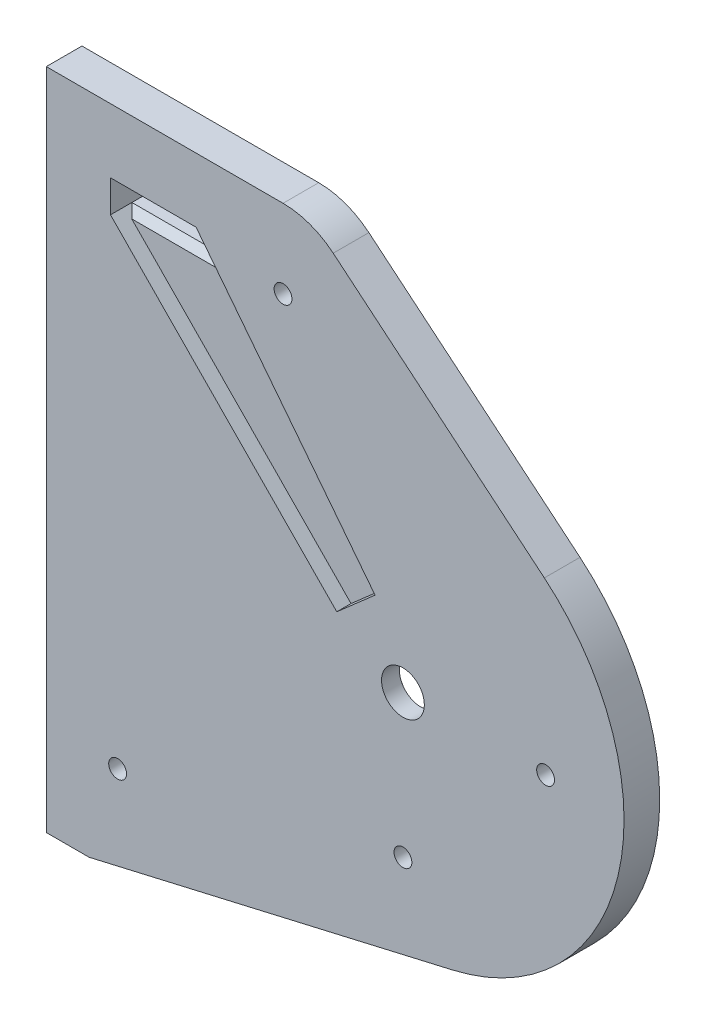
ISO-10303-21;
HEADER;
FILE_DESCRIPTION(('STEP AP214'),'2;1');
FILE_NAME('part.step','',(''),(''),'','','');
FILE_SCHEMA(('AUTOMOTIVE_DESIGN { 1 0 10303 214 1 1 1 1 }'));
ENDSEC;
DATA;
#1=APPLICATION_CONTEXT('core data for automotive mechanical design processes');
#2=APPLICATION_PROTOCOL_DEFINITION('international standard','automotive_design',2000,#1);
#3=PRODUCT_CONTEXT('',#1,'mechanical');
#4=PRODUCT('Part','Part','',(#3));
#5=PRODUCT_RELATED_PRODUCT_CATEGORY('part','',(#4));
#6=PRODUCT_DEFINITION_FORMATION('','',#4);
#7=PRODUCT_DEFINITION_CONTEXT('part definition',#1,'design');
#8=PRODUCT_DEFINITION('design','',#6,#7);
#9=PRODUCT_DEFINITION_SHAPE('','',#8);
#10=(LENGTH_UNIT() NAMED_UNIT(*) SI_UNIT(.MILLI.,.METRE.));
#11=(NAMED_UNIT(*) PLANE_ANGLE_UNIT() SI_UNIT($,.RADIAN.));
#12=(NAMED_UNIT(*) SI_UNIT($,.STERADIAN.) SOLID_ANGLE_UNIT());
#13=UNCERTAINTY_MEASURE_WITH_UNIT(LENGTH_MEASURE(1.E-05),#10,'distance_accuracy_value','');
#14=(GEOMETRIC_REPRESENTATION_CONTEXT(3) GLOBAL_UNCERTAINTY_ASSIGNED_CONTEXT((#13)) GLOBAL_UNIT_ASSIGNED_CONTEXT((#10,
#11,#12)) REPRESENTATION_CONTEXT('',''));
#15=CARTESIAN_POINT('',(0.,0.,0.));
#16=DIRECTION('',(0.,0.,1.));
#17=DIRECTION('',(1.,0.,0.));
#18=AXIS2_PLACEMENT_3D('',#15,#16,#17);
#19=CARTESIAN_POINT('',(50.,-30.,5.));
#20=DIRECTION('',(0.,0.,-1.));
#21=DIRECTION('',(-1.,0.,0.));
#22=AXIS2_PLACEMENT_3D('',#19,#20,#21);
#23=CYLINDRICAL_SURFACE('',#22,3.);
#24=CARTESIAN_POINT('',(50.,-30.,5.));
#25=DIRECTION('',(0.,0.,1.));
#26=DIRECTION('',(1.,0.,0.));
#27=AXIS2_PLACEMENT_3D('',#24,#25,#26);
#28=CIRCLE('',#27,3.);
#29=CARTESIAN_POINT('',(53.,-30.,5.));
#30=VERTEX_POINT('',#29);
#31=EDGE_CURVE('E277',#30,#30,#28,.T.);
#32=ORIENTED_EDGE('',*,*,#31,.T.);
#33=EDGE_LOOP('',(#32));
#34=FACE_BOUND('',#33,.T.);
#35=CARTESIAN_POINT('',(50.,-30.,2.5));
#36=DIRECTION('',(0.,0.,-1.));
#37=DIRECTION('',(-1.,0.,0.));
#38=AXIS2_PLACEMENT_3D('',#35,#36,#37);
#39=CIRCLE('',#38,3.);
#40=CARTESIAN_POINT('',(47.,-30.,2.5));
#41=VERTEX_POINT('',#40);
#42=EDGE_CURVE('E239',#41,#41,#39,.T.);
#43=ORIENTED_EDGE('',*,*,#42,.T.);
#44=EDGE_LOOP('',(#43));
#45=FACE_BOUND('',#44,.T.);
#46=ADVANCED_FACE('F45',(#34,#45),#23,.F.);
#47=CARTESIAN_POINT('',(0.,7.50000000000001,5.));
#48=DIRECTION('',(0.,-1.,0.));
#49=DIRECTION('',(0.,0.,-1.));
#50=AXIS2_PLACEMENT_3D('',#47,#48,#49);
#51=PLANE('',#50);
#52=DIRECTION('',(0.,0.,-1.));
#53=VECTOR('',#52,1.);
#54=CARTESIAN_POINT('',(9.00000000000003,7.50000000000001,5.));
#55=LINE('',#54,#53);
#56=CARTESIAN_POINT('',(9.00000000000003,7.50000000000001,1.99999999999999));
#57=VERTEX_POINT('',#56);
#58=CARTESIAN_POINT('',(9.00000000000003,7.50000000000001,0.));
#59=VERTEX_POINT('',#58);
#60=EDGE_CURVE('E371',#57,#59,#55,.T.);
#61=ORIENTED_EDGE('',*,*,#60,.F.);
#62=DIRECTION('',(1.,0.,0.));
#63=VECTOR('',#62,1.);
#64=CARTESIAN_POINT('',(21.,7.50000000000001,1.99999999999999));
#65=LINE('',#64,#63);
#66=CARTESIAN_POINT('',(21.,7.50000000000001,1.99999999999999));
#67=VERTEX_POINT('',#66);
#68=EDGE_CURVE('E379',#57,#67,#65,.T.);
#69=ORIENTED_EDGE('',*,*,#68,.T.);
#70=DIRECTION('',(0.,0.,-1.));
#71=VECTOR('',#70,1.);
#72=CARTESIAN_POINT('',(21.,7.50000000000001,5.));
#73=LINE('',#72,#71);
#74=CARTESIAN_POINT('',(21.,7.50000000000001,0.));
#75=VERTEX_POINT('',#74);
#76=EDGE_CURVE('E305',#67,#75,#73,.T.);
#77=ORIENTED_EDGE('',*,*,#76,.T.);
#78=DIRECTION('',(-1.,0.,0.));
#79=VECTOR('',#78,1.);
#80=CARTESIAN_POINT('',(0.,7.50000000000001,0.));
#81=LINE('',#80,#79);
#82=EDGE_CURVE('E308',#75,#59,#81,.T.);
#83=ORIENTED_EDGE('',*,*,#82,.T.);
#84=EDGE_LOOP('',(#61,#69,#77,#83));
#85=FACE_BOUND('',#84,.T.);
#86=ADVANCED_FACE('F398',(#85),#51,.F.);
#87=CARTESIAN_POINT('',(21.,0.,5.));
#88=DIRECTION('',(1.,0.,0.));
#89=DIRECTION('',(0.,0.,-1.));
#90=AXIS2_PLACEMENT_3D('',#87,#88,#89);
#91=PLANE('',#90);
#92=ORIENTED_EDGE('',*,*,#76,.F.);
#93=DIRECTION('',(0.,1.,0.));
#94=VECTOR('',#93,1.);
#95=CARTESIAN_POINT('',(21.,12.,1.99999999999999));
#96=LINE('',#95,#94);
#97=CARTESIAN_POINT('',(21.,12.,1.99999999999999));
#98=VERTEX_POINT('',#97);
#99=EDGE_CURVE('E381',#67,#98,#96,.T.);
#100=ORIENTED_EDGE('',*,*,#99,.T.);
#101=DIRECTION('',(0.,0.,-1.));
#102=VECTOR('',#101,1.);
#103=CARTESIAN_POINT('',(21.,12.,5.));
#104=LINE('',#103,#102);
#105=CARTESIAN_POINT('',(21.,12.,0.));
#106=VERTEX_POINT('',#105);
#107=EDGE_CURVE('E365',#98,#106,#104,.T.);
#108=ORIENTED_EDGE('',*,*,#107,.T.);
#109=DIRECTION('',(0.,-1.,0.));
#110=VECTOR('',#109,1.);
#111=CARTESIAN_POINT('',(21.,0.,0.));
#112=LINE('',#111,#110);
#113=EDGE_CURVE('E316',#106,#75,#112,.T.);
#114=ORIENTED_EDGE('',*,*,#113,.T.);
#115=EDGE_LOOP('',(#92,#100,#108,#114));
#116=FACE_BOUND('',#115,.T.);
#117=ADVANCED_FACE('F401',(#116),#91,.F.);
#118=CARTESIAN_POINT('',(25.5284479970524,30.6848702544959,5.));
#119=DIRECTION('',(-0.639559108163189,-0.768741924943285,0.));
#120=DIRECTION('',(0.768741924943285,-0.639559108163189,0.));
#121=AXIS2_PLACEMENT_3D('',#118,#119,#120);
#122=PLANE('',#121);
#123=DIRECTION('',(-0.768741924943285,0.639559108163189,0.));
#124=VECTOR('',#123,1.);
#125=CARTESIAN_POINT('',(25.5284479970524,30.6848702544959,0.));
#126=LINE('',#125,#124);
#127=CARTESIAN_POINT('',(69.8263323530596,-6.16900032675825,0.));
#128=VERTEX_POINT('',#127);
#129=CARTESIAN_POINT('',(40.2272009939749,18.4561611743761,0.));
#130=VERTEX_POINT('',#129);
#131=EDGE_CURVE('E328',#128,#130,#126,.T.);
#132=ORIENTED_EDGE('',*,*,#131,.T.);
#133=DIRECTION('',(0.,0.,-1.));
#134=VECTOR('',#133,1.);
#135=CARTESIAN_POINT('',(40.2272009939749,18.4561611743761,5.));
#136=LINE('',#135,#134);
#137=CARTESIAN_POINT('',(40.2272009939749,18.4561611743761,5.));
#138=VERTEX_POINT('',#137);
#139=EDGE_CURVE('E360',#138,#130,#136,.T.);
#140=ORIENTED_EDGE('',*,*,#139,.F.);
#141=DIRECTION('',(-0.768741924943285,0.639559108163189,0.));
#142=VECTOR('',#141,1.);
#143=CARTESIAN_POINT('',(25.5284479970524,30.6848702544959,5.));
#144=LINE('',#143,#142);
#145=CARTESIAN_POINT('',(69.8263323530596,-6.16900032675825,5.));
#146=VERTEX_POINT('',#145);
#147=EDGE_CURVE('E289',#146,#138,#144,.T.);
#148=ORIENTED_EDGE('',*,*,#147,.F.);
#149=DIRECTION('',(0.,0.,-1.));
#150=VECTOR('',#149,1.);
#151=CARTESIAN_POINT('',(69.8263323530596,-6.16900032675825,5.));
#152=LINE('',#151,#150);
#153=EDGE_CURVE('E344',#146,#128,#152,.T.);
#154=ORIENTED_EDGE('',*,*,#153,.T.);
#155=EDGE_LOOP('',(#132,#140,#148,#154));
#156=FACE_BOUND('',#155,.T.);
#157=ADVANCED_FACE('F457',(#156),#122,.F.);
#158=CARTESIAN_POINT('',(33.1920508041798,9.99999999999995,5.));
#159=DIRECTION('',(0.,0.,-1.));
#160=DIRECTION('',(-1.,0.,0.));
#161=AXIS2_PLACEMENT_3D('',#158,#159,#160);
#162=CYLINDRICAL_SURFACE('',#161,11.);
#163=CARTESIAN_POINT('',(33.1920508041798,9.99999999999995,0.));
#164=DIRECTION('',(0.,0.,1.));
#165=DIRECTION('',(1.,0.,0.));
#166=AXIS2_PLACEMENT_3D('',#163,#164,#165);
#167=CIRCLE('',#166,11.);
#168=CARTESIAN_POINT('',(33.1920508041798,21.,0.));
#169=VERTEX_POINT('',#168);
#170=EDGE_CURVE('E331',#130,#169,#167,.T.);
#171=ORIENTED_EDGE('',*,*,#170,.T.);
#172=DIRECTION('',(0.,0.,-1.));
#173=VECTOR('',#172,1.);
#174=CARTESIAN_POINT('',(33.1920508041798,21.,5.));
#175=LINE('',#174,#173);
#176=CARTESIAN_POINT('',(33.1920508041798,21.,5.));
#177=VERTEX_POINT('',#176);
#178=EDGE_CURVE('E358',#177,#169,#175,.T.);
#179=ORIENTED_EDGE('',*,*,#178,.F.);
#180=CARTESIAN_POINT('',(33.1920508041798,9.99999999999995,5.));
#181=DIRECTION('',(0.,0.,1.));
#182=DIRECTION('',(1.,0.,0.));
#183=AXIS2_PLACEMENT_3D('',#180,#181,#182);
#184=CIRCLE('',#183,11.);
#185=EDGE_CURVE('E292',#138,#177,#184,.T.);
#186=ORIENTED_EDGE('',*,*,#185,.F.);
#187=ORIENTED_EDGE('',*,*,#139,.T.);
#188=EDGE_LOOP('',(#171,#179,#186,#187));
#189=FACE_BOUND('',#188,.T.);
#190=ADVANCED_FACE('F461',(#189),#162,.T.);
#191=CARTESIAN_POINT('',(0.,21.,5.));
#192=DIRECTION('',(0.,1.,0.));
#193=DIRECTION('',(0.,0.,1.));
#194=AXIS2_PLACEMENT_3D('',#191,#192,#193);
#195=PLANE('',#194);
#196=DIRECTION('',(1.,0.,0.));
#197=VECTOR('',#196,1.);
#198=CARTESIAN_POINT('',(0.,21.,0.));
#199=LINE('',#198,#197);
#200=CARTESIAN_POINT('',(7.35522753814166E-13,21.,0.));
#201=VERTEX_POINT('',#200);
#202=EDGE_CURVE('E334',#201,#169,#199,.T.);
#203=ORIENTED_EDGE('',*,*,#202,.F.);
#204=DIRECTION('',(0.,0.,-1.));
#205=VECTOR('',#204,1.);
#206=CARTESIAN_POINT('',(7.35522753814166E-13,21.,5.));
#207=LINE('',#206,#205);
#208=CARTESIAN_POINT('',(7.35522753814166E-13,21.,5.));
#209=VERTEX_POINT('',#208);
#210=EDGE_CURVE('E356',#209,#201,#207,.T.);
#211=ORIENTED_EDGE('',*,*,#210,.F.);
#212=DIRECTION('',(1.,0.,0.));
#213=VECTOR('',#212,1.);
#214=CARTESIAN_POINT('',(0.,21.,5.));
#215=LINE('',#214,#213);
#216=EDGE_CURVE('E294',#209,#177,#215,.T.);
#217=ORIENTED_EDGE('',*,*,#216,.T.);
#218=ORIENTED_EDGE('',*,*,#178,.T.);
#219=EDGE_LOOP('',(#203,#211,#217,#218));
#220=FACE_BOUND('',#219,.T.);
#221=ADVANCED_FACE('F467',(#220),#195,.T.);
#222=CARTESIAN_POINT('',(7.11236625150491E-13,0.,5.));
#223=DIRECTION('',(1.,0.,0.));
#224=DIRECTION('',(0.,1.,0.));
#225=AXIS2_PLACEMENT_3D('',#222,#223,#224);
#226=PLANE('',#225);
#227=DIRECTION('',(0.,-1.,0.));
#228=VECTOR('',#227,1.);
#229=CARTESIAN_POINT('',(7.11236625150491E-13,0.,0.));
#230=LINE('',#229,#228);
#231=CARTESIAN_POINT('',(7.42461647718073E-13,-72.0000000000001,0.));
#232=VERTEX_POINT('',#231);
#233=EDGE_CURVE('E337',#201,#232,#230,.T.);
#234=ORIENTED_EDGE('',*,*,#233,.T.);
#235=DIRECTION('',(0.,0.,-1.));
#236=VECTOR('',#235,1.);
#237=CARTESIAN_POINT('',(7.42461647718073E-13,-72.0000000000001,5.));
#238=LINE('',#237,#236);
#239=CARTESIAN_POINT('',(7.42461647718073E-13,-72.0000000000001,5.));
#240=VERTEX_POINT('',#239);
#241=EDGE_CURVE('E353',#240,#232,#238,.T.);
#242=ORIENTED_EDGE('',*,*,#241,.F.);
#243=DIRECTION('',(0.,-1.,0.));
#244=VECTOR('',#243,1.);
#245=CARTESIAN_POINT('',(7.11236625150491E-13,0.,5.));
#246=LINE('',#245,#244);
#247=EDGE_CURVE('E297',#209,#240,#246,.T.);
#248=ORIENTED_EDGE('',*,*,#247,.F.);
#249=ORIENTED_EDGE('',*,*,#210,.T.);
#250=EDGE_LOOP('',(#234,#242,#248,#249));
#251=FACE_BOUND('',#250,.T.);
#252=ADVANCED_FACE('F512',(#251),#226,.F.);
#253=CARTESIAN_POINT('',(0.,-72.0000000000001,5.));
#254=DIRECTION('',(0.,1.,0.));
#255=DIRECTION('',(0.,0.,1.));
#256=AXIS2_PLACEMENT_3D('',#253,#254,#255);
#257=PLANE('',#256);
#258=DIRECTION('',(1.,0.,0.));
#259=VECTOR('',#258,1.);
#260=CARTESIAN_POINT('',(0.,-72.0000000000001,0.));
#261=LINE('',#260,#259);
#262=CARTESIAN_POINT('',(6.00000000000074,-72.0000000000001,0.));
#263=VERTEX_POINT('',#262);
#264=EDGE_CURVE('E339',#232,#263,#261,.T.);
#265=ORIENTED_EDGE('',*,*,#264,.T.);
#266=DIRECTION('',(0.,0.,-1.));
#267=VECTOR('',#266,1.);
#268=CARTESIAN_POINT('',(6.00000000000074,-72.0000000000001,5.));
#269=LINE('',#268,#267);
#270=CARTESIAN_POINT('',(6.00000000000074,-72.0000000000001,5.));
#271=VERTEX_POINT('',#270);
#272=EDGE_CURVE('E350',#271,#263,#269,.T.);
#273=ORIENTED_EDGE('',*,*,#272,.F.);
#274=DIRECTION('',(1.,0.,0.));
#275=VECTOR('',#274,1.);
#276=CARTESIAN_POINT('',(0.,-72.0000000000001,5.));
#277=LINE('',#276,#275);
#278=EDGE_CURVE('E299',#240,#271,#277,.T.);
#279=ORIENTED_EDGE('',*,*,#278,.F.);
#280=ORIENTED_EDGE('',*,*,#241,.T.);
#281=EDGE_LOOP('',(#265,#273,#279,#280));
#282=FACE_BOUND('',#281,.T.);
#283=ADVANCED_FACE('F441',(#282),#257,.F.);
#284=CARTESIAN_POINT('',(16.1180427608808,-69.6588317403281,5.));
#285=DIRECTION('',(-0.225429505450206,0.974259481900215,0.));
#286=DIRECTION('',(-0.974259481900215,-0.225429505450206,0.));
#287=AXIS2_PLACEMENT_3D('',#284,#285,#286);
#288=PLANE('',#287);
#289=DIRECTION('',(0.974259481900215,0.225429505450206,0.));
#290=VECTOR('',#289,1.);
#291=CARTESIAN_POINT('',(16.1180427608808,-69.6588317403281,0.));
#292=LINE('',#291,#290);
#293=CARTESIAN_POINT('',(56.9883146689571,-60.2020439389067,0.));
#294=VERTEX_POINT('',#293);
#295=EDGE_CURVE('E341',#263,#294,#292,.T.);
#296=ORIENTED_EDGE('',*,*,#295,.T.);
#297=DIRECTION('',(0.,0.,-1.));
#298=VECTOR('',#297,1.);
#299=CARTESIAN_POINT('',(56.9883146689571,-60.2020439389067,5.));
#300=LINE('',#299,#298);
#301=CARTESIAN_POINT('',(56.9883146689571,-60.2020439389067,5.));
#302=VERTEX_POINT('',#301);
#303=EDGE_CURVE('E347',#302,#294,#300,.T.);
#304=ORIENTED_EDGE('',*,*,#303,.F.);
#305=DIRECTION('',(0.974259481900215,0.225429505450206,0.));
#306=VECTOR('',#305,1.);
#307=CARTESIAN_POINT('',(16.1180427608808,-69.6588317403281,5.));
#308=LINE('',#307,#306);
#309=EDGE_CURVE('E301',#271,#302,#308,.T.);
#310=ORIENTED_EDGE('',*,*,#309,.F.);
#311=ORIENTED_EDGE('',*,*,#272,.T.);
#312=EDGE_LOOP('',(#296,#304,#310,#311));
#313=FACE_BOUND('',#312,.T.);
#314=ADVANCED_FACE('F433',(#313),#288,.F.);
#315=CARTESIAN_POINT('',(9.00000000000003,0.,5.));
#316=DIRECTION('',(-1.,0.,0.));
#317=DIRECTION('',(0.,0.,1.));
#318=AXIS2_PLACEMENT_3D('',#315,#316,#317);
#319=PLANE('',#318);
#320=DIRECTION('',(0.,1.,0.));
#321=VECTOR('',#320,1.);
#322=CARTESIAN_POINT('',(9.00000000000003,0.,0.));
#323=LINE('',#322,#321);
#324=CARTESIAN_POINT('',(9.00000000000003,12.,0.));
#325=VERTEX_POINT('',#324);
#326=EDGE_CURVE('E311',#59,#325,#323,.T.);
#327=ORIENTED_EDGE('',*,*,#326,.T.);
#328=DIRECTION('',(0.,0.,-1.));
#329=VECTOR('',#328,1.);
#330=CARTESIAN_POINT('',(9.00000000000003,12.,5.));
#331=LINE('',#330,#329);
#332=CARTESIAN_POINT('',(9.00000000000003,12.,5.));
#333=VERTEX_POINT('',#332);
#334=EDGE_CURVE('E368',#333,#325,#331,.T.);
#335=ORIENTED_EDGE('',*,*,#334,.F.);
#336=DIRECTION('',(0.,1.,0.));
#337=VECTOR('',#336,1.);
#338=CARTESIAN_POINT('',(9.00000000000003,0.,5.));
#339=LINE('',#338,#337);
#340=CARTESIAN_POINT('',(9.00000000000003,7.50000000000001,5.));
#341=VERTEX_POINT('',#340);
#342=EDGE_CURVE('E271',#341,#333,#339,.T.);
#343=ORIENTED_EDGE('',*,*,#342,.F.);
#344=EDGE_CURVE('E62',#341,#57,#55,.T.);
#345=ORIENTED_EDGE('',*,*,#344,.T.);
#346=ORIENTED_EDGE('',*,*,#60,.T.);
#347=EDGE_LOOP('',(#327,#335,#343,#345,#346));
#348=FACE_BOUND('',#347,.T.);
#349=ADVANCED_FACE('F431',(#348),#319,.F.);
#350=CARTESIAN_POINT('',(0.,12.,5.));
#351=DIRECTION('',(0.,1.,0.));
#352=DIRECTION('',(0.,0.,1.));
#353=AXIS2_PLACEMENT_3D('',#350,#351,#352);
#354=PLANE('',#353);
#355=DIRECTION('',(1.,0.,0.));
#356=VECTOR('',#355,1.);
#357=CARTESIAN_POINT('',(0.,12.,0.));
#358=LINE('',#357,#356);
#359=EDGE_CURVE('E313',#325,#106,#358,.T.);
#360=ORIENTED_EDGE('',*,*,#359,.T.);
#361=ORIENTED_EDGE('',*,*,#107,.F.);
#362=CARTESIAN_POINT('',(21.,12.,5.));
#363=VERTEX_POINT('',#362);
#364=EDGE_CURVE('E366',#363,#98,#104,.T.);
#365=ORIENTED_EDGE('',*,*,#364,.F.);
#366=DIRECTION('',(1.,0.,0.));
#367=VECTOR('',#366,1.);
#368=CARTESIAN_POINT('',(0.,12.,5.));
#369=LINE('',#368,#367);
#370=EDGE_CURVE('E274',#333,#363,#369,.T.);
#371=ORIENTED_EDGE('',*,*,#370,.F.);
#372=ORIENTED_EDGE('',*,*,#334,.T.);
#373=EDGE_LOOP('',(#360,#361,#365,#371,#372));
#374=FACE_BOUND('',#373,.T.);
#375=ADVANCED_FACE('F425',(#374),#354,.F.);
#376=CARTESIAN_POINT('',(33.1920508041791,10.,5.));
#377=DIRECTION('',(0.,0.,-1.));
#378=DIRECTION('',(-1.,0.,0.));
#379=AXIS2_PLACEMENT_3D('',#376,#377,#378);
#380=CYLINDRICAL_SURFACE('',#379,1.25000000000001);
#381=CARTESIAN_POINT('',(33.1920508041791,10.,5.));
#382=DIRECTION('',(0.,0.,1.));
#383=DIRECTION('',(1.,0.,0.));
#384=AXIS2_PLACEMENT_3D('',#381,#382,#383);
#385=CIRCLE('',#384,1.25000000000001);
#386=CARTESIAN_POINT('',(34.4420508041791,10.,5.));
#387=VERTEX_POINT('',#386);
#388=EDGE_CURVE('E286',#387,#387,#385,.T.);
#389=ORIENTED_EDGE('',*,*,#388,.T.);
#390=EDGE_LOOP('',(#389));
#391=FACE_BOUND('',#390,.T.);
#392=CARTESIAN_POINT('',(33.1920508041791,10.,0.));
#393=DIRECTION('',(0.,0.,1.));
#394=DIRECTION('',(1.,0.,0.));
#395=AXIS2_PLACEMENT_3D('',#392,#393,#394);
#396=CIRCLE('',#395,1.25000000000001);
#397=CARTESIAN_POINT('',(34.4420508041791,10.,0.));
#398=VERTEX_POINT('',#397);
#399=EDGE_CURVE('E325',#398,#398,#396,.T.);
#400=ORIENTED_EDGE('',*,*,#399,.F.);
#401=EDGE_LOOP('',(#400));
#402=FACE_BOUND('',#401,.T.);
#403=ADVANCED_FACE('F439',(#391,#402),#380,.F.);
#404=CARTESIAN_POINT('',(69.9999999999971,-30.,5.));
#405=DIRECTION('',(0.,0.,-1.));
#406=DIRECTION('',(-1.,0.,0.));
#407=AXIS2_PLACEMENT_3D('',#404,#405,#406);
#408=CYLINDRICAL_SURFACE('',#407,1.25000000000301);
#409=CARTESIAN_POINT('',(69.9999999999971,-30.,5.));
#410=DIRECTION('',(0.,0.,1.));
#411=DIRECTION('',(1.,0.,0.));
#412=AXIS2_PLACEMENT_3D('',#409,#410,#411);
#413=CIRCLE('',#412,1.25000000000301);
#414=CARTESIAN_POINT('',(71.2500000000002,-30.,5.));
#415=VERTEX_POINT('',#414);
#416=EDGE_CURVE('E283',#415,#415,#413,.T.);
#417=ORIENTED_EDGE('',*,*,#416,.T.);
#418=EDGE_LOOP('',(#417));
#419=FACE_BOUND('',#418,.T.);
#420=CARTESIAN_POINT('',(69.9999999999971,-30.,0.));
#421=DIRECTION('',(0.,0.,1.));
#422=DIRECTION('',(1.,0.,0.));
#423=AXIS2_PLACEMENT_3D('',#420,#421,#422);
#424=CIRCLE('',#423,1.25000000000301);
#425=CARTESIAN_POINT('',(71.2500000000002,-30.,0.));
#426=VERTEX_POINT('',#425);
#427=EDGE_CURVE('E322',#426,#426,#424,.T.);
#428=ORIENTED_EDGE('',*,*,#427,.F.);
#429=EDGE_LOOP('',(#428));
#430=FACE_BOUND('',#429,.T.);
#431=ADVANCED_FACE('F473',(#419,#430),#408,.F.);
#432=CARTESIAN_POINT('',(50.,-50.0000000000118,5.));
#433=DIRECTION('',(0.,0.,-1.));
#434=DIRECTION('',(-1.,0.,0.));
#435=AXIS2_PLACEMENT_3D('',#432,#433,#434);
#436=CYLINDRICAL_SURFACE('',#435,1.2500000000038);
#437=CARTESIAN_POINT('',(50.,-50.0000000000118,5.));
#438=DIRECTION('',(0.,0.,1.));
#439=DIRECTION('',(1.,0.,0.));
#440=AXIS2_PLACEMENT_3D('',#437,#438,#439);
#441=CIRCLE('',#440,1.2500000000038);
#442=CARTESIAN_POINT('',(51.2500000000038,-50.0000000000118,5.));
#443=VERTEX_POINT('',#442);
#444=EDGE_CURVE('E280',#443,#443,#441,.T.);
#445=ORIENTED_EDGE('',*,*,#444,.T.);
#446=EDGE_LOOP('',(#445));
#447=FACE_BOUND('',#446,.T.);
#448=CARTESIAN_POINT('',(50.,-50.0000000000118,0.));
#449=DIRECTION('',(0.,0.,1.));
#450=DIRECTION('',(1.,0.,0.));
#451=AXIS2_PLACEMENT_3D('',#448,#449,#450);
#452=CIRCLE('',#451,1.2500000000038);
#453=CARTESIAN_POINT('',(51.2500000000038,-50.0000000000118,0.));
#454=VERTEX_POINT('',#453);
#455=EDGE_CURVE('E319',#454,#454,#452,.T.);
#456=ORIENTED_EDGE('',*,*,#455,.F.);
#457=EDGE_LOOP('',(#456));
#458=FACE_BOUND('',#457,.T.);
#459=ADVANCED_FACE('F454',(#447,#458),#436,.F.);
#460=CARTESIAN_POINT('',(10.,-59.255419511476,5.));
#461=DIRECTION('',(0.,0.,-1.));
#462=DIRECTION('',(-1.,0.,0.));
#463=AXIS2_PLACEMENT_3D('',#460,#461,#462);
#464=CYLINDRICAL_SURFACE('',#463,1.25000000000378);
#465=CARTESIAN_POINT('',(10.,-59.255419511476,5.));
#466=DIRECTION('',(0.,0.,1.));
#467=DIRECTION('',(1.,0.,0.));
#468=AXIS2_PLACEMENT_3D('',#465,#466,#467);
#469=CIRCLE('',#468,1.25000000000378);
#470=CARTESIAN_POINT('',(11.2500000000038,-59.255419511476,5.));
#471=VERTEX_POINT('',#470);
#472=EDGE_CURVE('E268',#471,#471,#469,.T.);
#473=ORIENTED_EDGE('',*,*,#472,.T.);
#474=EDGE_LOOP('',(#473));
#475=FACE_BOUND('',#474,.T.);
#476=CARTESIAN_POINT('',(10.,-59.255419511476,0.));
#477=DIRECTION('',(0.,0.,1.));
#478=DIRECTION('',(1.,0.,0.));
#479=AXIS2_PLACEMENT_3D('',#476,#477,#478);
#480=CIRCLE('',#479,1.25000000000378);
#481=CARTESIAN_POINT('',(11.2500000000038,-59.255419511476,0.));
#482=VERTEX_POINT('',#481);
#483=EDGE_CURVE('E266',#482,#482,#480,.T.);
#484=ORIENTED_EDGE('',*,*,#483,.F.);
#485=EDGE_LOOP('',(#484));
#486=FACE_BOUND('',#485,.T.);
#487=ADVANCED_FACE('F480',(#475,#486),#464,.F.);
#488=CARTESIAN_POINT('',(50.0000000000007,-30.0000000000001,5.));
#489=DIRECTION('',(0.,0.,-1.));
#490=DIRECTION('',(-1.,0.,0.));
#491=AXIS2_PLACEMENT_3D('',#488,#489,#490);
#492=CYLINDRICAL_SURFACE('',#491,31.);
#493=CARTESIAN_POINT('',(50.0000000000007,-30.0000000000001,0.));
#494=DIRECTION('',(0.,0.,1.));
#495=DIRECTION('',(1.,0.,0.));
#496=AXIS2_PLACEMENT_3D('',#493,#494,#495);
#497=CIRCLE('',#496,31.);
#498=EDGE_CURVE('E272',#294,#128,#497,.T.);
#499=ORIENTED_EDGE('',*,*,#498,.T.);
#500=ORIENTED_EDGE('',*,*,#153,.F.);
#501=CARTESIAN_POINT('',(50.0000000000007,-30.0000000000001,5.));
#502=DIRECTION('',(0.,0.,1.));
#503=DIRECTION('',(1.,0.,0.));
#504=AXIS2_PLACEMENT_3D('',#501,#502,#503);
#505=CIRCLE('',#504,31.);
#506=EDGE_CURVE('E303',#302,#146,#505,.T.);
#507=ORIENTED_EDGE('',*,*,#506,.F.);
#508=ORIENTED_EDGE('',*,*,#303,.T.);
#509=EDGE_LOOP('',(#499,#500,#507,#508));
#510=FACE_BOUND('',#509,.T.);
#511=ADVANCED_FACE('F500',(#510),#492,.T.);
#512=CARTESIAN_POINT('',(0.,0.,5.));
#513=DIRECTION('',(0.,0.,1.));
#514=DIRECTION('',(1.,0.,0.));
#515=AXIS2_PLACEMENT_3D('',#512,#513,#514);
#516=PLANE('',#515);
#517=DIRECTION('',(-0.615576870453516,0.788076846863715,0.));
#518=VECTOR('',#517,1.);
#519=CARTESIAN_POINT('',(46.0943723555017,-20.1264407244182,5.));
#520=LINE('',#519,#518);
#521=CARTESIAN_POINT('',(46.0943723555017,-20.1264407244182,5.));
#522=VERTEX_POINT('',#521);
#523=EDGE_CURVE('E250',#522,#363,#520,.T.);
#524=ORIENTED_EDGE('',*,*,#523,.F.);
#525=DIRECTION('',(0.752117734878096,0.659028764836438,0.));
#526=VECTOR('',#525,1.);
#527=CARTESIAN_POINT('',(40.7250523477695,-24.83120457802,5.));
#528=LINE('',#527,#526);
#529=CARTESIAN_POINT('',(40.7250523477695,-24.83120457802,5.));
#530=VERTEX_POINT('',#529);
#531=EDGE_CURVE('E260',#530,#522,#528,.T.);
#532=ORIENTED_EDGE('',*,*,#531,.F.);
#533=DIRECTION('',(0.700384206431914,-0.713766042468215,0.));
#534=VECTOR('',#533,1.);
#535=CARTESIAN_POINT('',(9.00000000000003,7.50000000000001,5.));
#536=LINE('',#535,#534);
#537=EDGE_CURVE('E257',#341,#530,#536,.T.);
#538=ORIENTED_EDGE('',*,*,#537,.F.);
#539=ORIENTED_EDGE('',*,*,#342,.T.);
#540=ORIENTED_EDGE('',*,*,#370,.T.);
#541=EDGE_LOOP('',(#524,#532,#538,#539,#540));
#542=FACE_BOUND('',#541,.T.);
#543=ORIENTED_EDGE('',*,*,#472,.F.);
#544=EDGE_LOOP('',(#543));
#545=FACE_BOUND('',#544,.T.);
#546=ORIENTED_EDGE('',*,*,#31,.F.);
#547=EDGE_LOOP('',(#546));
#548=FACE_BOUND('',#547,.T.);
#549=ORIENTED_EDGE('',*,*,#444,.F.);
#550=EDGE_LOOP('',(#549));
#551=FACE_BOUND('',#550,.T.);
#552=ORIENTED_EDGE('',*,*,#416,.F.);
#553=EDGE_LOOP('',(#552));
#554=FACE_BOUND('',#553,.T.);
#555=ORIENTED_EDGE('',*,*,#388,.F.);
#556=EDGE_LOOP('',(#555));
#557=FACE_BOUND('',#556,.T.);
#558=ORIENTED_EDGE('',*,*,#147,.T.);
#559=ORIENTED_EDGE('',*,*,#185,.T.);
#560=ORIENTED_EDGE('',*,*,#216,.F.);
#561=ORIENTED_EDGE('',*,*,#247,.T.);
#562=ORIENTED_EDGE('',*,*,#278,.T.);
#563=ORIENTED_EDGE('',*,*,#309,.T.);
#564=ORIENTED_EDGE('',*,*,#506,.T.);
#565=EDGE_LOOP('',(#558,#559,#560,#561,#562,#563,#564));
#566=FACE_BOUND('',#565,.T.);
#567=ADVANCED_FACE('F421',(#542,#545,#548,#551,#554,#557,#566),#516,.T.);
#568=CARTESIAN_POINT('',(0.,0.,0.));
#569=DIRECTION('',(0.,0.,1.));
#570=DIRECTION('',(1.,0.,0.));
#571=AXIS2_PLACEMENT_3D('',#568,#569,#570);
#572=PLANE('',#571);
#573=DIRECTION('',(0.5,0.866025403784439,0.));
#574=VECTOR('',#573,1.);
#575=CARTESIAN_POINT('',(42.6099165543728,-30.,0.));
#576=LINE('',#575,#574);
#577=CARTESIAN_POINT('',(42.6099165543728,-30.,0.));
#578=VERTEX_POINT('',#577);
#579=CARTESIAN_POINT('',(46.3049582771864,-23.6,0.));
#580=VERTEX_POINT('',#579);
#581=EDGE_CURVE('E227',#578,#580,#576,.T.);
#582=ORIENTED_EDGE('',*,*,#581,.F.);
#583=DIRECTION('',(-0.5,0.866025403784439,0.));
#584=VECTOR('',#583,1.);
#585=CARTESIAN_POINT('',(46.3049582771864,-36.4,0.));
#586=LINE('',#585,#584);
#587=CARTESIAN_POINT('',(46.3049582771864,-36.4,0.));
#588=VERTEX_POINT('',#587);
#589=EDGE_CURVE('E195',#588,#578,#586,.T.);
#590=ORIENTED_EDGE('',*,*,#589,.F.);
#591=DIRECTION('',(-1.,0.,0.));
#592=VECTOR('',#591,1.);
#593=CARTESIAN_POINT('',(53.6950417228136,-36.4,0.));
#594=LINE('',#593,#592);
#595=CARTESIAN_POINT('',(53.6950417228136,-36.4,0.));
#596=VERTEX_POINT('',#595);
#597=EDGE_CURVE('E213',#596,#588,#594,.T.);
#598=ORIENTED_EDGE('',*,*,#597,.F.);
#599=DIRECTION('',(-0.5,-0.866025403784439,0.));
#600=VECTOR('',#599,1.);
#601=CARTESIAN_POINT('',(57.3900834456272,-30.,0.));
#602=LINE('',#601,#600);
#603=CARTESIAN_POINT('',(57.3900834456272,-30.,0.));
#604=VERTEX_POINT('',#603);
#605=EDGE_CURVE('E216',#604,#596,#602,.T.);
#606=ORIENTED_EDGE('',*,*,#605,.F.);
#607=DIRECTION('',(0.5,-0.866025403784439,0.));
#608=VECTOR('',#607,1.);
#609=CARTESIAN_POINT('',(53.6950417228136,-23.6,0.));
#610=LINE('',#609,#608);
#611=CARTESIAN_POINT('',(53.6950417228136,-23.6,0.));
#612=VERTEX_POINT('',#611);
#613=EDGE_CURVE('E232',#612,#604,#610,.T.);
#614=ORIENTED_EDGE('',*,*,#613,.F.);
#615=DIRECTION('',(1.,0.,0.));
#616=VECTOR('',#615,1.);
#617=CARTESIAN_POINT('',(46.3049582771864,-23.6,0.));
#618=LINE('',#617,#616);
#619=EDGE_CURVE('E229',#580,#612,#618,.T.);
#620=ORIENTED_EDGE('',*,*,#619,.F.);
#621=EDGE_LOOP('',(#582,#590,#598,#606,#614,#620));
#622=FACE_BOUND('',#621,.T.);
#623=ORIENTED_EDGE('',*,*,#483,.T.);
#624=EDGE_LOOP('',(#623));
#625=FACE_BOUND('',#624,.T.);
#626=ORIENTED_EDGE('',*,*,#82,.F.);
#627=ORIENTED_EDGE('',*,*,#113,.F.);
#628=ORIENTED_EDGE('',*,*,#359,.F.);
#629=ORIENTED_EDGE('',*,*,#326,.F.);
#630=EDGE_LOOP('',(#626,#627,#628,#629));
#631=FACE_BOUND('',#630,.T.);
#632=ORIENTED_EDGE('',*,*,#455,.T.);
#633=EDGE_LOOP('',(#632));
#634=FACE_BOUND('',#633,.T.);
#635=ORIENTED_EDGE('',*,*,#427,.T.);
#636=EDGE_LOOP('',(#635));
#637=FACE_BOUND('',#636,.T.);
#638=ORIENTED_EDGE('',*,*,#399,.T.);
#639=EDGE_LOOP('',(#638));
#640=FACE_BOUND('',#639,.T.);
#641=ORIENTED_EDGE('',*,*,#131,.F.);
#642=ORIENTED_EDGE('',*,*,#498,.F.);
#643=ORIENTED_EDGE('',*,*,#295,.F.);
#644=ORIENTED_EDGE('',*,*,#264,.F.);
#645=ORIENTED_EDGE('',*,*,#233,.F.);
#646=ORIENTED_EDGE('',*,*,#202,.T.);
#647=ORIENTED_EDGE('',*,*,#170,.F.);
#648=EDGE_LOOP('',(#641,#642,#643,#644,#645,#646,#647));
#649=FACE_BOUND('',#648,.T.);
#650=ADVANCED_FACE('F429',(#622,#625,#631,#634,#637,#640,#649),#572,.F.);
#651=CARTESIAN_POINT('',(0.,0.,3.));
#652=DIRECTION('',(0.,0.,1.));
#653=DIRECTION('',(1.,0.,0.));
#654=AXIS2_PLACEMENT_3D('',#651,#652,#653);
#655=PLANE('',#654);
#656=DIRECTION('',(0.,-1.,0.));
#657=VECTOR('',#656,1.);
#658=CARTESIAN_POINT('',(22.0000000000001,7.50000000000001,3.));
#659=LINE('',#658,#657);
#660=CARTESIAN_POINT('',(22.0000000000001,10.7197750846566,3.));
#661=VERTEX_POINT('',#660);
#662=CARTESIAN_POINT('',(22.0000000000001,6.49999999999999,3.));
#663=VERTEX_POINT('',#662);
#664=EDGE_CURVE('E363',#661,#663,#659,.T.);
#665=ORIENTED_EDGE('',*,*,#664,.T.);
#666=DIRECTION('',(-1.,0.,0.));
#667=VECTOR('',#666,1.);
#668=CARTESIAN_POINT('',(9.00000000000003,6.49999999999999,3.));
#669=LINE('',#668,#667);
#670=CARTESIAN_POINT('',(9.98125178946592,6.49999999999999,3.));
#671=VERTEX_POINT('',#670);
#672=EDGE_CURVE('E376',#663,#671,#669,.T.);
#673=ORIENTED_EDGE('',*,*,#672,.T.);
#674=DIRECTION('',(0.700384206431914,-0.713766042468215,0.));
#675=VECTOR('',#674,1.);
#676=CARTESIAN_POINT('',(9.00000000000003,7.50000000000001,3.));
#677=LINE('',#676,#675);
#678=CARTESIAN_POINT('',(40.7250523477695,-24.83120457802,3.));
#679=VERTEX_POINT('',#678);
#680=EDGE_CURVE('E247',#671,#679,#677,.T.);
#681=ORIENTED_EDGE('',*,*,#680,.T.);
#682=DIRECTION('',(0.752117734878096,0.659028764836438,0.));
#683=VECTOR('',#682,1.);
#684=CARTESIAN_POINT('',(40.7250523477695,-24.83120457802,3.));
#685=LINE('',#684,#683);
#686=CARTESIAN_POINT('',(46.0943723555017,-20.1264407244182,3.));
#687=VERTEX_POINT('',#686);
#688=EDGE_CURVE('E249',#679,#687,#685,.T.);
#689=ORIENTED_EDGE('',*,*,#688,.T.);
#690=DIRECTION('',(-0.615576870453516,0.788076846863715,0.));
#691=VECTOR('',#690,1.);
#692=CARTESIAN_POINT('',(46.0943723555017,-20.1264407244182,3.));
#693=LINE('',#692,#691);
#694=EDGE_CURVE('E253',#687,#661,#693,.T.);
#695=ORIENTED_EDGE('',*,*,#694,.T.);
#696=EDGE_LOOP('',(#665,#673,#681,#689,#695));
#697=FACE_BOUND('',#696,.T.);
#698=ADVANCED_FACE('F413',(#697),#655,.T.);
#699=CARTESIAN_POINT('',(46.0943723555017,-20.1264407244182,3.));
#700=DIRECTION('',(0.788076846863715,0.615576870453516,0.));
#701=DIRECTION('',(-0.615576870453516,0.788076846863715,0.));
#702=AXIS2_PLACEMENT_3D('',#699,#700,#701);
#703=PLANE('',#702);
#704=ORIENTED_EDGE('',*,*,#523,.T.);
#705=ORIENTED_EDGE('',*,*,#364,.T.);
#706=DIRECTION('',(0.524216171413154,-0.671114603669053,0.524216171413154));
#707=VECTOR('',#706,1.);
#708=CARTESIAN_POINT('',(39.4731763224674,-11.6498205935547,20.4731763224673));
#709=LINE('',#708,#707);
#710=EDGE_CURVE('E11',#98,#661,#709,.T.);
#711=ORIENTED_EDGE('',*,*,#710,.T.);
#712=ORIENTED_EDGE('',*,*,#694,.F.);
#713=DIRECTION('',(0.,0.,1.));
#714=VECTOR('',#713,1.);
#715=CARTESIAN_POINT('',(46.0943723555017,-20.1264407244182,3.));
#716=LINE('',#715,#714);
#717=EDGE_CURVE('E264',#687,#522,#716,.T.);
#718=ORIENTED_EDGE('',*,*,#717,.T.);
#719=EDGE_LOOP('',(#704,#705,#711,#712,#718));
#720=FACE_BOUND('',#719,.T.);
#721=ADVANCED_FACE('F410',(#720),#703,.F.);
#722=CARTESIAN_POINT('',(40.7250523477695,-24.83120457802,3.));
#723=DIRECTION('',(0.659028764836438,-0.752117734878096,0.));
#724=DIRECTION('',(0.752117734878096,0.659028764836438,0.));
#725=AXIS2_PLACEMENT_3D('',#722,#723,#724);
#726=PLANE('',#725);
#727=ORIENTED_EDGE('',*,*,#531,.T.);
#728=ORIENTED_EDGE('',*,*,#717,.F.);
#729=ORIENTED_EDGE('',*,*,#688,.F.);
#730=DIRECTION('',(0.,0.,1.));
#731=VECTOR('',#730,1.);
#732=CARTESIAN_POINT('',(40.7250523477695,-24.83120457802,3.));
#733=LINE('',#732,#731);
#734=EDGE_CURVE('E256',#679,#530,#733,.T.);
#735=ORIENTED_EDGE('',*,*,#734,.T.);
#736=EDGE_LOOP('',(#727,#728,#729,#735));
#737=FACE_BOUND('',#736,.T.);
#738=ADVANCED_FACE('F416',(#737),#726,.F.);
#739=CARTESIAN_POINT('',(9.00000000000003,7.50000000000001,3.));
#740=DIRECTION('',(-0.713766042468215,-0.700384206431914,0.));
#741=DIRECTION('',(0.700384206431914,-0.713766042468215,0.));
#742=AXIS2_PLACEMENT_3D('',#739,#740,#741);
#743=PLANE('',#742);
#744=ORIENTED_EDGE('',*,*,#537,.T.);
#745=ORIENTED_EDGE('',*,*,#734,.F.);
#746=ORIENTED_EDGE('',*,*,#680,.F.);
#747=DIRECTION('',(-0.570066154692427,0.580958079070336,-0.580958079070336));
#748=VECTOR('',#747,1.);
#749=CARTESIAN_POINT('',(9.33118453817316,7.16248771036291,2.33751228963709));
#750=LINE('',#749,#748);
#751=EDGE_CURVE('E56',#671,#57,#750,.T.);
#752=ORIENTED_EDGE('',*,*,#751,.T.);
#753=ORIENTED_EDGE('',*,*,#344,.F.);
#754=EDGE_LOOP('',(#744,#745,#746,#752,#753));
#755=FACE_BOUND('',#754,.T.);
#756=ADVANCED_FACE('F388',(#755),#743,.F.);
#757=CARTESIAN_POINT('',(46.3049582771864,-36.4,2.5));
#758=DIRECTION('',(-0.866025403784439,-0.5,0.));
#759=DIRECTION('',(0.5,-0.866025403784439,0.));
#760=AXIS2_PLACEMENT_3D('',#757,#758,#759);
#761=PLANE('',#760);
#762=ORIENTED_EDGE('',*,*,#589,.T.);
#763=DIRECTION('',(0.,0.,-1.));
#764=VECTOR('',#763,1.);
#765=CARTESIAN_POINT('',(42.6099165543728,-30.,2.5));
#766=LINE('',#765,#764);
#767=CARTESIAN_POINT('',(42.6099165543728,-30.,2.5));
#768=VERTEX_POINT('',#767);
#769=EDGE_CURVE('E188',#768,#578,#766,.T.);
#770=ORIENTED_EDGE('',*,*,#769,.F.);
#771=DIRECTION('',(-0.5,0.866025403784439,0.));
#772=VECTOR('',#771,1.);
#773=CARTESIAN_POINT('',(46.3049582771864,-36.4,2.5));
#774=LINE('',#773,#772);
#775=CARTESIAN_POINT('',(46.3049582771864,-36.4,2.5));
#776=VERTEX_POINT('',#775);
#777=EDGE_CURVE('E192',#776,#768,#774,.T.);
#778=ORIENTED_EDGE('',*,*,#777,.F.);
#779=DIRECTION('',(0.,0.,-1.));
#780=VECTOR('',#779,1.);
#781=CARTESIAN_POINT('',(46.3049582771864,-36.4,2.5));
#782=LINE('',#781,#780);
#783=EDGE_CURVE('E237',#776,#588,#782,.T.);
#784=ORIENTED_EDGE('',*,*,#783,.T.);
#785=EDGE_LOOP('',(#762,#770,#778,#784));
#786=FACE_BOUND('',#785,.T.);
#787=ADVANCED_FACE('F190',(#786),#761,.F.);
#788=CARTESIAN_POINT('',(53.6950417228136,-36.4,2.5));
#789=DIRECTION('',(0.,-1.,0.));
#790=DIRECTION('',(0.,0.,-1.));
#791=AXIS2_PLACEMENT_3D('',#788,#789,#790);
#792=PLANE('',#791);
#793=ORIENTED_EDGE('',*,*,#597,.T.);
#794=ORIENTED_EDGE('',*,*,#783,.F.);
#795=DIRECTION('',(-1.,0.,0.));
#796=VECTOR('',#795,1.);
#797=CARTESIAN_POINT('',(53.6950417228136,-36.4,2.5));
#798=LINE('',#797,#796);
#799=CARTESIAN_POINT('',(53.6950417228136,-36.4,2.5));
#800=VERTEX_POINT('',#799);
#801=EDGE_CURVE('E200',#800,#776,#798,.T.);
#802=ORIENTED_EDGE('',*,*,#801,.F.);
#803=DIRECTION('',(0.,0.,-1.));
#804=VECTOR('',#803,1.);
#805=CARTESIAN_POINT('',(53.6950417228136,-36.4,2.5));
#806=LINE('',#805,#804);
#807=EDGE_CURVE('E240',#800,#596,#806,.T.);
#808=ORIENTED_EDGE('',*,*,#807,.T.);
#809=EDGE_LOOP('',(#793,#794,#802,#808));
#810=FACE_BOUND('',#809,.T.);
#811=ADVANCED_FACE('F626',(#810),#792,.F.);
#812=CARTESIAN_POINT('',(57.3900834456272,-30.,2.5));
#813=DIRECTION('',(0.866025403784439,-0.5,0.));
#814=DIRECTION('',(0.5,0.866025403784439,0.));
#815=AXIS2_PLACEMENT_3D('',#812,#813,#814);
#816=PLANE('',#815);
#817=ORIENTED_EDGE('',*,*,#605,.T.);
#818=ORIENTED_EDGE('',*,*,#807,.F.);
#819=DIRECTION('',(-0.5,-0.866025403784439,0.));
#820=VECTOR('',#819,1.);
#821=CARTESIAN_POINT('',(57.3900834456272,-30.,2.5));
#822=LINE('',#821,#820);
#823=CARTESIAN_POINT('',(57.3900834456272,-30.,2.5));
#824=VERTEX_POINT('',#823);
#825=EDGE_CURVE('E223',#824,#800,#822,.T.);
#826=ORIENTED_EDGE('',*,*,#825,.F.);
#827=DIRECTION('',(0.,0.,-1.));
#828=VECTOR('',#827,1.);
#829=CARTESIAN_POINT('',(57.3900834456272,-30.,2.5));
#830=LINE('',#829,#828);
#831=EDGE_CURVE('E242',#824,#604,#830,.T.);
#832=ORIENTED_EDGE('',*,*,#831,.T.);
#833=EDGE_LOOP('',(#817,#818,#826,#832));
#834=FACE_BOUND('',#833,.T.);
#835=ADVANCED_FACE('F635',(#834),#816,.F.);
#836=CARTESIAN_POINT('',(53.6950417228136,-23.6,2.5));
#837=DIRECTION('',(0.866025403784439,0.5,0.));
#838=DIRECTION('',(-0.5,0.866025403784439,0.));
#839=AXIS2_PLACEMENT_3D('',#836,#837,#838);
#840=PLANE('',#839);
#841=ORIENTED_EDGE('',*,*,#613,.T.);
#842=ORIENTED_EDGE('',*,*,#831,.F.);
#843=DIRECTION('',(0.5,-0.866025403784439,0.));
#844=VECTOR('',#843,1.);
#845=CARTESIAN_POINT('',(53.6950417228136,-23.6,2.5));
#846=LINE('',#845,#844);
#847=CARTESIAN_POINT('',(53.6950417228136,-23.6,2.5));
#848=VERTEX_POINT('',#847);
#849=EDGE_CURVE('E220',#848,#824,#846,.T.);
#850=ORIENTED_EDGE('',*,*,#849,.F.);
#851=DIRECTION('',(0.,0.,-1.));
#852=VECTOR('',#851,1.);
#853=CARTESIAN_POINT('',(53.6950417228136,-23.6,2.5));
#854=LINE('',#853,#852);
#855=EDGE_CURVE('E244',#848,#612,#854,.T.);
#856=ORIENTED_EDGE('',*,*,#855,.T.);
#857=EDGE_LOOP('',(#841,#842,#850,#856));
#858=FACE_BOUND('',#857,.T.);
#859=ADVANCED_FACE('F646',(#858),#840,.F.);
#860=CARTESIAN_POINT('',(46.3049582771864,-23.6,2.5));
#861=DIRECTION('',(0.,1.,0.));
#862=DIRECTION('',(0.,0.,1.));
#863=AXIS2_PLACEMENT_3D('',#860,#861,#862);
#864=PLANE('',#863);
#865=ORIENTED_EDGE('',*,*,#619,.T.);
#866=ORIENTED_EDGE('',*,*,#855,.F.);
#867=DIRECTION('',(1.,0.,0.));
#868=VECTOR('',#867,1.);
#869=CARTESIAN_POINT('',(46.3049582771864,-23.6,2.5));
#870=LINE('',#869,#868);
#871=CARTESIAN_POINT('',(46.3049582771864,-23.6,2.5));
#872=VERTEX_POINT('',#871);
#873=EDGE_CURVE('E208',#872,#848,#870,.T.);
#874=ORIENTED_EDGE('',*,*,#873,.F.);
#875=DIRECTION('',(0.,0.,-1.));
#876=VECTOR('',#875,1.);
#877=CARTESIAN_POINT('',(46.3049582771864,-23.6,2.5));
#878=LINE('',#877,#876);
#879=EDGE_CURVE('E199',#872,#580,#878,.T.);
#880=ORIENTED_EDGE('',*,*,#879,.T.);
#881=EDGE_LOOP('',(#865,#866,#874,#880));
#882=FACE_BOUND('',#881,.T.);
#883=ADVANCED_FACE('F657',(#882),#864,.F.);
#884=CARTESIAN_POINT('',(42.6099165543728,-30.,2.5));
#885=DIRECTION('',(-0.866025403784439,0.5,0.));
#886=DIRECTION('',(-0.5,-0.866025403784439,0.));
#887=AXIS2_PLACEMENT_3D('',#884,#885,#886);
#888=PLANE('',#887);
#889=ORIENTED_EDGE('',*,*,#581,.T.);
#890=ORIENTED_EDGE('',*,*,#879,.F.);
#891=DIRECTION('',(0.5,0.866025403784439,0.));
#892=VECTOR('',#891,1.);
#893=CARTESIAN_POINT('',(42.6099165543728,-30.,2.5));
#894=LINE('',#893,#892);
#895=EDGE_CURVE('E203',#768,#872,#894,.T.);
#896=ORIENTED_EDGE('',*,*,#895,.F.);
#897=ORIENTED_EDGE('',*,*,#769,.T.);
#898=EDGE_LOOP('',(#889,#890,#896,#897));
#899=FACE_BOUND('',#898,.T.);
#900=ADVANCED_FACE('F204',(#899),#888,.F.);
#901=CARTESIAN_POINT('',(0.,0.,2.5));
#902=DIRECTION('',(0.,0.,-1.));
#903=DIRECTION('',(-1.,0.,0.));
#904=AXIS2_PLACEMENT_3D('',#901,#902,#903);
#905=PLANE('',#904);
#906=ORIENTED_EDGE('',*,*,#42,.F.);
#907=EDGE_LOOP('',(#906));
#908=FACE_BOUND('',#907,.T.);
#909=ORIENTED_EDGE('',*,*,#777,.T.);
#910=ORIENTED_EDGE('',*,*,#895,.T.);
#911=ORIENTED_EDGE('',*,*,#873,.T.);
#912=ORIENTED_EDGE('',*,*,#849,.T.);
#913=ORIENTED_EDGE('',*,*,#825,.T.);
#914=ORIENTED_EDGE('',*,*,#801,.T.);
#915=EDGE_LOOP('',(#909,#910,#911,#912,#913,#914));
#916=FACE_BOUND('',#915,.T.);
#917=ADVANCED_FACE('F210',(#908,#916),#905,.T.);
#918=CARTESIAN_POINT('',(22.0000000000001,0.,3.));
#919=DIRECTION('',(-0.707106781186547,0.,0.707106781186547));
#920=DIRECTION('',(0.,1.,0.));
#921=AXIS2_PLACEMENT_3D('',#918,#919,#920);
#922=PLANE('',#921);
#923=ORIENTED_EDGE('',*,*,#710,.F.);
#924=ORIENTED_EDGE('',*,*,#99,.F.);
#925=DIRECTION('',(0.577350269189626,-0.577350269189626,0.577350269189626));
#926=VECTOR('',#925,1.);
#927=CARTESIAN_POINT('',(14.6666666666667,13.8333333333333,-4.33333333333335));
#928=LINE('',#927,#926);
#929=EDGE_CURVE('E50',#663,#67,#928,.F.);
#930=ORIENTED_EDGE('',*,*,#929,.F.);
#931=ORIENTED_EDGE('',*,*,#664,.F.);
#932=EDGE_LOOP('',(#923,#924,#930,#931));
#933=FACE_BOUND('',#932,.T.);
#934=ADVANCED_FACE('F48',(#933),#922,.T.);
#935=CARTESIAN_POINT('',(0.,6.49999999999999,3.));
#936=DIRECTION('',(0.,0.707106781186547,0.707106781186547));
#937=DIRECTION('',(1.,0.,0.));
#938=AXIS2_PLACEMENT_3D('',#935,#936,#937);
#939=PLANE('',#938);
#940=ORIENTED_EDGE('',*,*,#929,.T.);
#941=ORIENTED_EDGE('',*,*,#68,.F.);
#942=ORIENTED_EDGE('',*,*,#751,.F.);
#943=ORIENTED_EDGE('',*,*,#672,.F.);
#944=EDGE_LOOP('',(#940,#941,#942,#943));
#945=FACE_BOUND('',#944,.T.);
#946=ADVANCED_FACE('F394',(#945),#939,.T.);
#947=CLOSED_SHELL('',(#46,#86,#117,#157,#190,#221,#252,#283,#314,#349,#375,#403,#431,#459,#487,
#511,#567,#650,#698,#721,#738,#756,#787,#811,#835,#859,#883,#900,#917,#934,#946));
#948=MANIFOLD_SOLID_BREP('B2',#947);
#949=ADVANCED_BREP_SHAPE_REPRESENTATION('',(#18,#948),#14);
#950=SHAPE_DEFINITION_REPRESENTATION(#9,#949);
ENDSEC;
END-ISO-10303-21;
